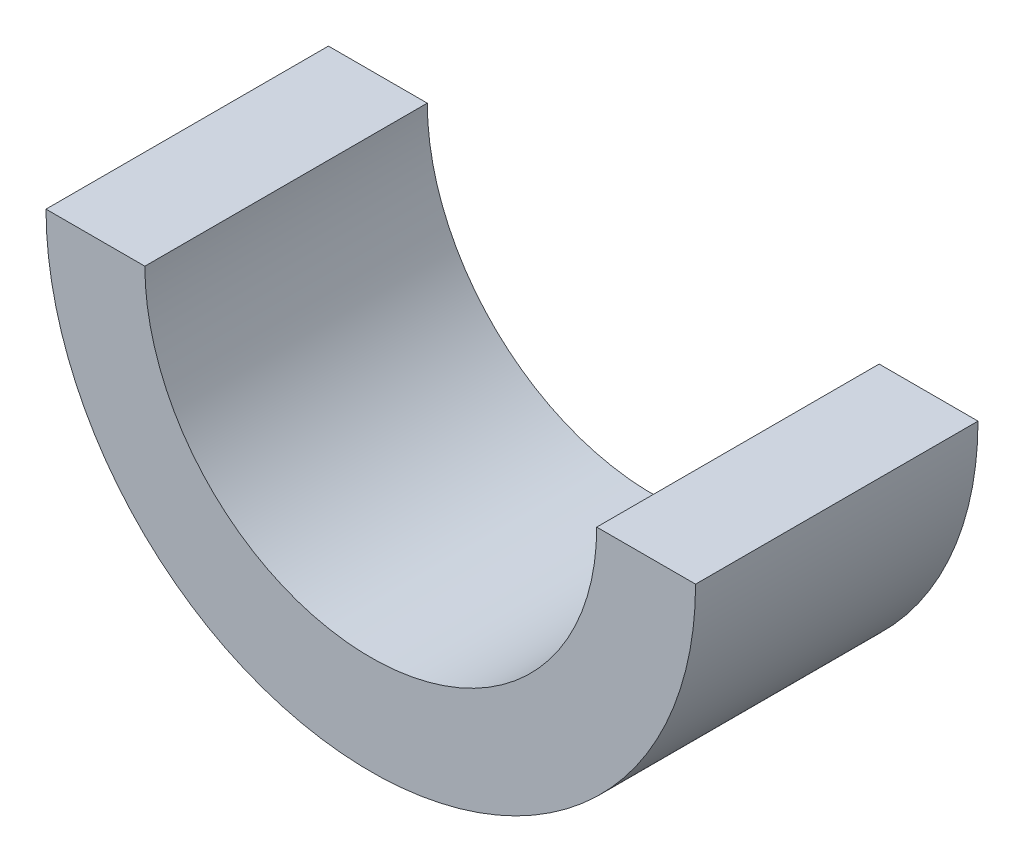
ISO-10303-21;
HEADER;
FILE_DESCRIPTION(('STEP AP214'),'2;1');
FILE_NAME('part.step','',(''),(''),'','','');
FILE_SCHEMA(('AUTOMOTIVE_DESIGN { 1 0 10303 214 1 1 1 1 }'));
ENDSEC;
DATA;
#1=APPLICATION_CONTEXT('core data for automotive mechanical design processes');
#2=APPLICATION_PROTOCOL_DEFINITION('international standard','automotive_design',2000,#1);
#3=PRODUCT_CONTEXT('',#1,'mechanical');
#4=PRODUCT('Part','Part','',(#3));
#5=PRODUCT_RELATED_PRODUCT_CATEGORY('part','',(#4));
#6=PRODUCT_DEFINITION_FORMATION('','',#4);
#7=PRODUCT_DEFINITION_CONTEXT('part definition',#1,'design');
#8=PRODUCT_DEFINITION('design','',#6,#7);
#9=PRODUCT_DEFINITION_SHAPE('','',#8);
#10=(LENGTH_UNIT() NAMED_UNIT(*) SI_UNIT(.MILLI.,.METRE.));
#11=(NAMED_UNIT(*) PLANE_ANGLE_UNIT() SI_UNIT($,.RADIAN.));
#12=(NAMED_UNIT(*) SI_UNIT($,.STERADIAN.) SOLID_ANGLE_UNIT());
#13=UNCERTAINTY_MEASURE_WITH_UNIT(LENGTH_MEASURE(1.E-05),#10,'distance_accuracy_value','');
#14=(GEOMETRIC_REPRESENTATION_CONTEXT(3) GLOBAL_UNCERTAINTY_ASSIGNED_CONTEXT((#13)) GLOBAL_UNIT_ASSIGNED_CONTEXT((#10,
#11,#12)) REPRESENTATION_CONTEXT('',''));
#15=CARTESIAN_POINT('',(0.,0.,0.));
#16=DIRECTION('',(0.,0.,1.));
#17=DIRECTION('',(1.,0.,0.));
#18=AXIS2_PLACEMENT_3D('',#15,#16,#17);
#19=CARTESIAN_POINT('',(23.,23.,20.));
#20=DIRECTION('',(0.,0.,-1.));
#21=DIRECTION('',(-1.,0.,0.));
#22=AXIS2_PLACEMENT_3D('',#19,#20,#21);
#23=CYLINDRICAL_SURFACE('',#22,23.);
#24=CARTESIAN_POINT('',(23.,23.,0.));
#25=DIRECTION('',(0.,0.,1.));
#26=DIRECTION('',(1.,0.,0.));
#27=AXIS2_PLACEMENT_3D('',#24,#25,#26);
#28=CIRCLE('',#27,23.);
#29=CARTESIAN_POINT('',(0.,23.,0.));
#30=VERTEX_POINT('',#29);
#31=CARTESIAN_POINT('',(46.,23.,0.));
#32=VERTEX_POINT('',#31);
#33=EDGE_CURVE('E108',#30,#32,#28,.T.);
#34=ORIENTED_EDGE('',*,*,#33,.T.);
#35=DIRECTION('',(0.,0.,-1.));
#36=VECTOR('',#35,1.);
#37=CARTESIAN_POINT('',(46.,23.,20.));
#38=LINE('',#37,#36);
#39=CARTESIAN_POINT('',(46.,23.,20.));
#40=VERTEX_POINT('',#39);
#41=EDGE_CURVE('E11',#40,#32,#38,.T.);
#42=ORIENTED_EDGE('',*,*,#41,.F.);
#43=CARTESIAN_POINT('',(23.,23.,20.));
#44=DIRECTION('',(0.,0.,1.));
#45=DIRECTION('',(1.,0.,0.));
#46=AXIS2_PLACEMENT_3D('',#43,#44,#45);
#47=CIRCLE('',#46,23.);
#48=CARTESIAN_POINT('',(0.,23.,20.));
#49=VERTEX_POINT('',#48);
#50=EDGE_CURVE('E92',#49,#40,#47,.T.);
#51=ORIENTED_EDGE('',*,*,#50,.F.);
#52=DIRECTION('',(0.,0.,-1.));
#53=VECTOR('',#52,1.);
#54=CARTESIAN_POINT('',(0.,23.,20.));
#55=LINE('',#54,#53);
#56=EDGE_CURVE('E105',#49,#30,#55,.T.);
#57=ORIENTED_EDGE('',*,*,#56,.T.);
#58=EDGE_LOOP('',(#34,#42,#51,#57));
#59=FACE_BOUND('',#58,.T.);
#60=ADVANCED_FACE('F43',(#59),#23,.T.);
#61=CARTESIAN_POINT('',(46.,23.,20.));
#62=DIRECTION('',(0.,-1.,0.));
#63=DIRECTION('',(0.,0.,-1.));
#64=AXIS2_PLACEMENT_3D('',#61,#62,#63);
#65=PLANE('',#64);
#66=DIRECTION('',(-1.,0.,0.));
#67=VECTOR('',#66,1.);
#68=CARTESIAN_POINT('',(46.,23.,0.));
#69=LINE('',#68,#67);
#70=CARTESIAN_POINT('',(39.,23.,0.));
#71=VERTEX_POINT('',#70);
#72=EDGE_CURVE('E97',#32,#71,#69,.T.);
#73=ORIENTED_EDGE('',*,*,#72,.T.);
#74=DIRECTION('',(0.,0.,-1.));
#75=VECTOR('',#74,1.);
#76=CARTESIAN_POINT('',(39.,23.,20.));
#77=LINE('',#76,#75);
#78=CARTESIAN_POINT('',(39.,23.,20.));
#79=VERTEX_POINT('',#78);
#80=EDGE_CURVE('E51',#79,#71,#77,.T.);
#81=ORIENTED_EDGE('',*,*,#80,.F.);
#82=DIRECTION('',(-1.,0.,0.));
#83=VECTOR('',#82,1.);
#84=CARTESIAN_POINT('',(46.,23.,20.));
#85=LINE('',#84,#83);
#86=EDGE_CURVE('E87',#40,#79,#85,.T.);
#87=ORIENTED_EDGE('',*,*,#86,.F.);
#88=ORIENTED_EDGE('',*,*,#41,.T.);
#89=EDGE_LOOP('',(#73,#81,#87,#88));
#90=FACE_BOUND('',#89,.T.);
#91=ADVANCED_FACE('F100',(#90),#65,.F.);
#92=CARTESIAN_POINT('',(23.,23.,20.));
#93=DIRECTION('',(0.,0.,-1.));
#94=DIRECTION('',(-1.,0.,0.));
#95=AXIS2_PLACEMENT_3D('',#92,#93,#94);
#96=CYLINDRICAL_SURFACE('',#95,16.);
#97=CARTESIAN_POINT('',(23.,23.,0.));
#98=DIRECTION('',(0.,0.,-1.));
#99=DIRECTION('',(-1.,0.,0.));
#100=AXIS2_PLACEMENT_3D('',#97,#98,#99);
#101=CIRCLE('',#100,16.);
#102=CARTESIAN_POINT('',(7.,23.,0.));
#103=VERTEX_POINT('',#102);
#104=EDGE_CURVE('E78',#71,#103,#101,.T.);
#105=ORIENTED_EDGE('',*,*,#104,.T.);
#106=DIRECTION('',(0.,0.,-1.));
#107=VECTOR('',#106,1.);
#108=CARTESIAN_POINT('',(7.,23.,20.));
#109=LINE('',#108,#107);
#110=CARTESIAN_POINT('',(7.,23.,20.));
#111=VERTEX_POINT('',#110);
#112=EDGE_CURVE('E98',#111,#103,#109,.T.);
#113=ORIENTED_EDGE('',*,*,#112,.F.);
#114=CARTESIAN_POINT('',(23.,23.,20.));
#115=DIRECTION('',(0.,0.,-1.));
#116=DIRECTION('',(-1.,0.,0.));
#117=AXIS2_PLACEMENT_3D('',#114,#115,#116);
#118=CIRCLE('',#117,16.);
#119=EDGE_CURVE('E95',#79,#111,#118,.T.);
#120=ORIENTED_EDGE('',*,*,#119,.F.);
#121=ORIENTED_EDGE('',*,*,#80,.T.);
#122=EDGE_LOOP('',(#105,#113,#120,#121));
#123=FACE_BOUND('',#122,.T.);
#124=ADVANCED_FACE('F99',(#123),#96,.F.);
#125=CARTESIAN_POINT('',(7.,23.,20.));
#126=DIRECTION('',(0.,-1.,0.));
#127=DIRECTION('',(0.,0.,-1.));
#128=AXIS2_PLACEMENT_3D('',#125,#126,#127);
#129=PLANE('',#128);
#130=DIRECTION('',(-1.,0.,0.));
#131=VECTOR('',#130,1.);
#132=CARTESIAN_POINT('',(7.,23.,0.));
#133=LINE('',#132,#131);
#134=EDGE_CURVE('E85',#103,#30,#133,.T.);
#135=ORIENTED_EDGE('',*,*,#134,.T.);
#136=ORIENTED_EDGE('',*,*,#56,.F.);
#137=DIRECTION('',(-1.,0.,0.));
#138=VECTOR('',#137,1.);
#139=CARTESIAN_POINT('',(7.,23.,20.));
#140=LINE('',#139,#138);
#141=EDGE_CURVE('E56',#111,#49,#140,.T.);
#142=ORIENTED_EDGE('',*,*,#141,.F.);
#143=ORIENTED_EDGE('',*,*,#112,.T.);
#144=EDGE_LOOP('',(#135,#136,#142,#143));
#145=FACE_BOUND('',#144,.T.);
#146=ADVANCED_FACE('F111',(#145),#129,.F.);
#147=CARTESIAN_POINT('',(23.,23.,20.));
#148=DIRECTION('',(0.,0.,1.));
#149=DIRECTION('',(1.,0.,0.));
#150=AXIS2_PLACEMENT_3D('',#147,#148,#149);
#151=PLANE('',#150);
#152=ORIENTED_EDGE('',*,*,#50,.T.);
#153=ORIENTED_EDGE('',*,*,#86,.T.);
#154=ORIENTED_EDGE('',*,*,#119,.T.);
#155=ORIENTED_EDGE('',*,*,#141,.T.);
#156=EDGE_LOOP('',(#152,#153,#154,#155));
#157=FACE_BOUND('',#156,.T.);
#158=ADVANCED_FACE('F89',(#157),#151,.T.);
#159=CARTESIAN_POINT('',(23.,23.,0.));
#160=DIRECTION('',(0.,0.,1.));
#161=DIRECTION('',(1.,0.,0.));
#162=AXIS2_PLACEMENT_3D('',#159,#160,#161);
#163=PLANE('',#162);
#164=ORIENTED_EDGE('',*,*,#33,.F.);
#165=ORIENTED_EDGE('',*,*,#134,.F.);
#166=ORIENTED_EDGE('',*,*,#104,.F.);
#167=ORIENTED_EDGE('',*,*,#72,.F.);
#168=EDGE_LOOP('',(#164,#165,#166,#167));
#169=FACE_BOUND('',#168,.T.);
#170=ADVANCED_FACE('F118',(#169),#163,.F.);
#171=CLOSED_SHELL('',(#60,#91,#124,#146,#158,#170));
#172=MANIFOLD_SOLID_BREP('B2',#171);
#173=ADVANCED_BREP_SHAPE_REPRESENTATION('',(#18,#172),#14);
#174=SHAPE_DEFINITION_REPRESENTATION(#9,#173);
ENDSEC;
END-ISO-10303-21;
